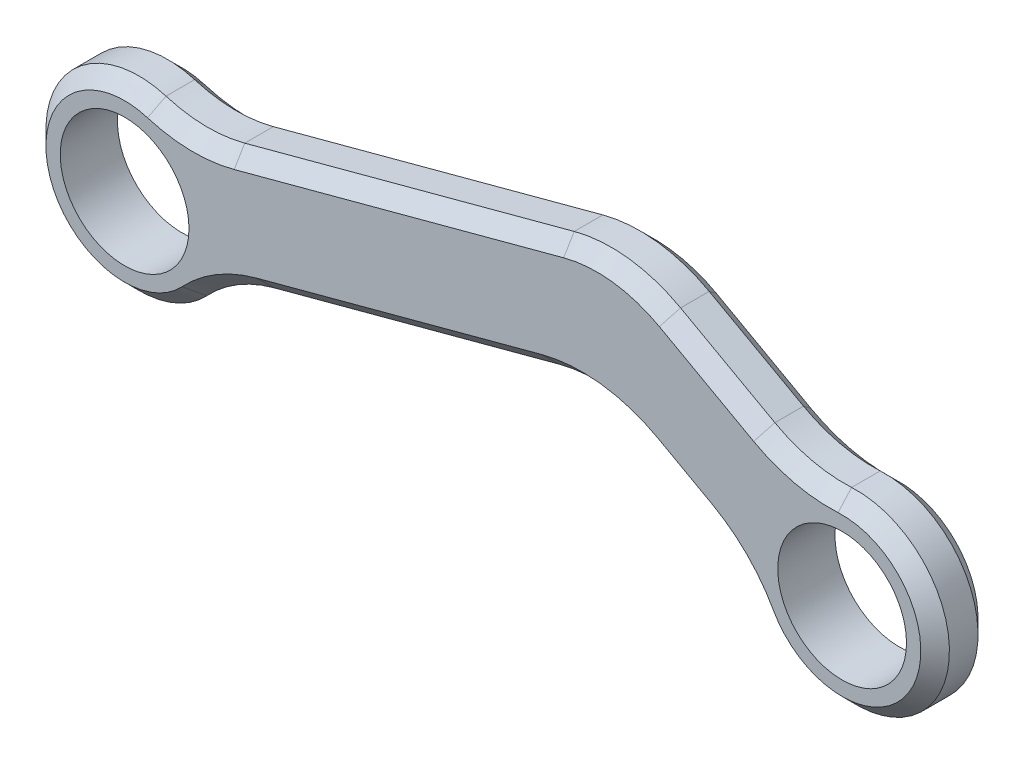
ISO-10303-21;
HEADER;
FILE_DESCRIPTION(('STEP AP214'),'2;1');
FILE_NAME('part.step','',(''),(''),'','','');
FILE_SCHEMA(('AUTOMOTIVE_DESIGN { 1 0 10303 214 1 1 1 1 }'));
ENDSEC;
DATA;
#1=APPLICATION_CONTEXT('core data for automotive mechanical design processes');
#2=APPLICATION_PROTOCOL_DEFINITION('international standard','automotive_design',2000,#1);
#3=PRODUCT_CONTEXT('',#1,'mechanical');
#4=PRODUCT('Part','Part','',(#3));
#5=PRODUCT_RELATED_PRODUCT_CATEGORY('part','',(#4));
#6=PRODUCT_DEFINITION_FORMATION('','',#4);
#7=PRODUCT_DEFINITION_CONTEXT('part definition',#1,'design');
#8=PRODUCT_DEFINITION('design','',#6,#7);
#9=PRODUCT_DEFINITION_SHAPE('','',#8);
#10=(LENGTH_UNIT() NAMED_UNIT(*) SI_UNIT(.MILLI.,.METRE.));
#11=(NAMED_UNIT(*) PLANE_ANGLE_UNIT() SI_UNIT($,.RADIAN.));
#12=(NAMED_UNIT(*) SI_UNIT($,.STERADIAN.) SOLID_ANGLE_UNIT());
#13=UNCERTAINTY_MEASURE_WITH_UNIT(LENGTH_MEASURE(1.E-05),#10,'distance_accuracy_value','');
#14=(GEOMETRIC_REPRESENTATION_CONTEXT(3) GLOBAL_UNCERTAINTY_ASSIGNED_CONTEXT((#13)) GLOBAL_UNIT_ASSIGNED_CONTEXT((#10,
#11,#12)) REPRESENTATION_CONTEXT('',''));
#15=CARTESIAN_POINT('',(0.,0.,0.));
#16=DIRECTION('',(0.,0.,1.));
#17=DIRECTION('',(1.,0.,0.));
#18=AXIS2_PLACEMENT_3D('',#15,#16,#17);
#19=CARTESIAN_POINT('',(50.16,0.,4.));
#20=DIRECTION('',(0.,0.,1.));
#21=DIRECTION('',(1.,0.,0.));
#22=AXIS2_PLACEMENT_3D('',#19,#20,#21);
#23=PLANE('',#22);
#24=DIRECTION('',(0.965925826289068,0.258819045102522,0.));
#25=VECTOR('',#24,1.);
#26=CARTESIAN_POINT('',(29.1223366760669,4.69747805282916,4.));
#27=LINE('',#26,#25);
#28=CARTESIAN_POINT('',(9.21104180316654,-0.637737328622465,4.));
#29=VERTEX_POINT('',#28);
#30=CARTESIAN_POINT('',(29.1223366760669,4.69747805282915,4.));
#31=VERTEX_POINT('',#30);
#32=EDGE_CURVE('E62',#29,#31,#27,.T.);
#33=ORIENTED_EDGE('',*,*,#32,.T.);
#34=CARTESIAN_POINT('',(31.9693461721946,-5.92770603635059,4.));
#35=DIRECTION('',(0.,0.,1.));
#36=DIRECTION('',(1.,0.,0.));
#37=AXIS2_PLACEMENT_3D('',#34,#35,#36);
#38=CIRCLE('',#37,11.);
#39=CARTESIAN_POINT('',(37.2996746676149,3.69453892680173,4.));
#40=VERTEX_POINT('',#39);
#41=EDGE_CURVE('E11',#31,#40,#38,.F.);
#42=ORIENTED_EDGE('',*,*,#41,.T.);
#43=DIRECTION('',(0.874749542104756,-0.484575317765484,0.));
#44=VECTOR('',#43,1.);
#45=CARTESIAN_POINT('',(41.0678520527508,1.60712342566822,4.));
#46=LINE('',#45,#44);
#47=CARTESIAN_POINT('',(41.0678520527508,1.60712342566822,4.));
#48=VERTEX_POINT('',#47);
#49=EDGE_CURVE('E51',#40,#48,#46,.T.);
#50=ORIENTED_EDGE('',*,*,#49,.T.);
#51=CARTESIAN_POINT('',(35.7375235573304,-8.0151215374841,4.));
#52=DIRECTION('',(0.,0.,1.));
#53=DIRECTION('',(1.,0.,0.));
#54=AXIS2_PLACEMENT_3D('',#51,#52,#53);
#55=CIRCLE('',#54,11.);
#56=CARTESIAN_POINT('',(45.3525078524435,-2.67170717916137,4.));
#57=VERTEX_POINT('',#56);
#58=EDGE_CURVE('E348',#48,#57,#55,.F.);
#59=ORIENTED_EDGE('',*,*,#58,.T.);
#60=CARTESIAN_POINT('',(50.16,0.,4.));
#61=DIRECTION('',(0.,0.,1.));
#62=DIRECTION('',(1.,0.,0.));
#63=AXIS2_PLACEMENT_3D('',#60,#61,#62);
#64=CIRCLE('',#63,5.5);
#65=CARTESIAN_POINT('',(49.8752108182547,5.49262188048302,4.));
#66=VERTEX_POINT('',#65);
#67=EDGE_CURVE('E344',#57,#66,#64,.T.);
#68=ORIENTED_EDGE('',*,*,#67,.T.);
#69=CARTESIAN_POINT('',(49.305632454764,16.4778656414491,4.));
#70=DIRECTION('',(0.,0.,1.));
#71=DIRECTION('',(1.,0.,0.));
#72=AXIS2_PLACEMENT_3D('',#69,#70,#71);
#73=CIRCLE('',#72,11.);
#74=CARTESIAN_POINT('',(43.9753039593437,6.85562067829675,4.));
#75=VERTEX_POINT('',#74);
#76=EDGE_CURVE('E340',#66,#75,#73,.F.);
#77=ORIENTED_EDGE('',*,*,#76,.T.);
#78=DIRECTION('',(-0.874749542104756,0.484575317765485,0.));
#79=VECTOR('',#78,1.);
#80=CARTESIAN_POINT('',(37.3808427451827,10.508681336843,4.));
#81=LINE('',#80,#79);
#82=CARTESIAN_POINT('',(37.3808427451827,10.508681336843,4.));
#83=VERTEX_POINT('',#82);
#84=EDGE_CURVE('E336',#75,#83,#81,.T.);
#85=ORIENTED_EDGE('',*,*,#84,.T.);
#86=CARTESIAN_POINT('',(33.0196648852933,2.63593545790018,4.));
#87=DIRECTION('',(0.,0.,1.));
#88=DIRECTION('',(1.,0.,0.));
#89=AXIS2_PLACEMENT_3D('',#86,#87,#88);
#90=CIRCLE('',#89,9.00000000000001);
#91=CARTESIAN_POINT('',(30.6902934793706,11.3292678945018,4.));
#92=VERTEX_POINT('',#91);
#93=EDGE_CURVE('E338',#83,#92,#90,.T.);
#94=ORIENTED_EDGE('',*,*,#93,.T.);
#95=DIRECTION('',(-0.965925826289068,-0.258819045102521,0.));
#96=VECTOR('',#95,1.);
#97=CARTESIAN_POINT('',(7.65812753255141,5.15781762911196,4.));
#98=LINE('',#97,#96);
#99=CARTESIAN_POINT('',(7.65812753255141,5.15781762911196,4.));
#100=VERTEX_POINT('',#99);
#101=EDGE_CURVE('E342',#92,#100,#98,.T.);
#102=ORIENTED_EDGE('',*,*,#101,.T.);
#103=CARTESIAN_POINT('',(4.81111803642367,15.7830017182917,4.));
#104=DIRECTION('',(0.,0.,1.));
#105=DIRECTION('',(1.,0.,0.));
#106=AXIS2_PLACEMENT_3D('',#103,#104,#105);
#107=CIRCLE('',#106,11.);
#108=CARTESIAN_POINT('',(1.60370601214123,5.2610005727639,4.));
#109=VERTEX_POINT('',#108);
#110=EDGE_CURVE('E346',#100,#109,#107,.F.);
#111=ORIENTED_EDGE('',*,*,#110,.T.);
#112=CARTESIAN_POINT('',(0.,0.,4.));
#113=DIRECTION('',(0.,0.,1.));
#114=DIRECTION('',(1.,0.,0.));
#115=AXIS2_PLACEMENT_3D('',#112,#113,#114);
#116=CIRCLE('',#115,5.50000000000001);
#117=CARTESIAN_POINT('',(4.01935043309809,-3.75430713926741,4.));
#118=VERTEX_POINT('',#117);
#119=EDGE_CURVE('E350',#109,#118,#116,.T.);
#120=ORIENTED_EDGE('',*,*,#119,.T.);
#121=CARTESIAN_POINT('',(12.0580512992943,-11.2629214178022,4.));
#122=DIRECTION('',(0.,0.,1.));
#123=DIRECTION('',(1.,0.,0.));
#124=AXIS2_PLACEMENT_3D('',#121,#122,#123);
#125=CIRCLE('',#124,11.);
#126=EDGE_CURVE('E352',#118,#29,#125,.F.);
#127=ORIENTED_EDGE('',*,*,#126,.T.);
#128=EDGE_LOOP('',(#33,#42,#50,#59,#68,#77,#85,#94,#102,#111,#120,#127));
#129=FACE_BOUND('',#128,.T.);
#130=CARTESIAN_POINT('',(0.,0.,4.));
#131=DIRECTION('',(0.,0.,1.));
#132=DIRECTION('',(1.,0.,0.));
#133=AXIS2_PLACEMENT_3D('',#130,#131,#132);
#134=CIRCLE('',#133,4.5);
#135=CARTESIAN_POINT('',(4.5,0.,4.));
#136=VERTEX_POINT('',#135);
#137=EDGE_CURVE('E691',#136,#136,#134,.T.);
#138=ORIENTED_EDGE('',*,*,#137,.F.);
#139=EDGE_LOOP('',(#138));
#140=FACE_BOUND('',#139,.T.);
#141=CARTESIAN_POINT('',(50.16,0.,4.));
#142=DIRECTION('',(0.,0.,1.));
#143=DIRECTION('',(1.,0.,0.));
#144=AXIS2_PLACEMENT_3D('',#141,#142,#143);
#145=CIRCLE('',#144,4.5);
#146=CARTESIAN_POINT('',(54.66,0.,4.));
#147=VERTEX_POINT('',#146);
#148=EDGE_CURVE('E713',#147,#147,#145,.T.);
#149=ORIENTED_EDGE('',*,*,#148,.F.);
#150=EDGE_LOOP('',(#149));
#151=FACE_BOUND('',#150,.T.);
#152=ADVANCED_FACE('F41',(#129,#140,#151),#23,.T.);
#153=CARTESIAN_POINT('',(50.16,0.,0.));
#154=DIRECTION('',(0.,0.,1.));
#155=DIRECTION('',(1.,0.,0.));
#156=AXIS2_PLACEMENT_3D('',#153,#154,#155);
#157=PLANE('',#156);
#158=DIRECTION('',(-0.874749542104756,0.484575317765484,0.));
#159=VECTOR('',#158,1.);
#160=CARTESIAN_POINT('',(48.7062740467035,-2.62424862631426,0.));
#161=LINE('',#160,#159);
#162=CARTESIAN_POINT('',(41.0678520527508,1.60712342566822,0.));
#163=VERTEX_POINT('',#162);
#164=CARTESIAN_POINT('',(37.2996746676149,3.69453892680172,0.));
#165=VERTEX_POINT('',#164);
#166=EDGE_CURVE('E426',#163,#165,#161,.T.);
#167=ORIENTED_EDGE('',*,*,#166,.T.);
#168=CARTESIAN_POINT('',(31.9693461721946,-5.92770603635059,0.));
#169=DIRECTION('',(0.,0.,1.));
#170=DIRECTION('',(1.,0.,0.));
#171=AXIS2_PLACEMENT_3D('',#168,#169,#170);
#172=CIRCLE('',#171,11.);
#173=CARTESIAN_POINT('',(29.1223366760669,4.69747805282915,0.));
#174=VERTEX_POINT('',#173);
#175=EDGE_CURVE('E430',#165,#174,#172,.T.);
#176=ORIENTED_EDGE('',*,*,#175,.T.);
#177=DIRECTION('',(-0.965925826289068,-0.258819045102522,0.));
#178=VECTOR('',#177,1.);
#179=CARTESIAN_POINT('',(47.5763742622213,9.64222252113282,0.));
#180=LINE('',#179,#178);
#181=CARTESIAN_POINT('',(9.21104180316654,-0.637737328622466,0.));
#182=VERTEX_POINT('',#181);
#183=EDGE_CURVE('E428',#174,#182,#180,.T.);
#184=ORIENTED_EDGE('',*,*,#183,.T.);
#185=CARTESIAN_POINT('',(12.0580512992943,-11.2629214178022,0.));
#186=DIRECTION('',(0.,0.,1.));
#187=DIRECTION('',(1.,0.,0.));
#188=AXIS2_PLACEMENT_3D('',#185,#186,#187);
#189=CIRCLE('',#188,11.);
#190=CARTESIAN_POINT('',(4.01935043309809,-3.75430713926741,0.));
#191=VERTEX_POINT('',#190);
#192=EDGE_CURVE('E424',#182,#191,#189,.T.);
#193=ORIENTED_EDGE('',*,*,#192,.T.);
#194=CARTESIAN_POINT('',(0.,0.,0.));
#195=DIRECTION('',(0.,0.,1.));
#196=DIRECTION('',(1.,0.,0.));
#197=AXIS2_PLACEMENT_3D('',#194,#195,#196);
#198=CIRCLE('',#197,5.50000000000001);
#199=CARTESIAN_POINT('',(1.60370601214122,5.2610005727639,0.));
#200=VERTEX_POINT('',#199);
#201=EDGE_CURVE('E420',#191,#200,#198,.F.);
#202=ORIENTED_EDGE('',*,*,#201,.T.);
#203=CARTESIAN_POINT('',(4.81111803642367,15.7830017182917,0.));
#204=DIRECTION('',(0.,0.,1.));
#205=DIRECTION('',(1.,0.,0.));
#206=AXIS2_PLACEMENT_3D('',#203,#204,#205);
#207=CIRCLE('',#206,11.);
#208=CARTESIAN_POINT('',(7.65812753255141,5.15781762911196,0.));
#209=VERTEX_POINT('',#208);
#210=EDGE_CURVE('E209',#200,#209,#207,.T.);
#211=ORIENTED_EDGE('',*,*,#210,.T.);
#212=DIRECTION('',(0.965925826289068,0.258819045102521,0.));
#213=VECTOR('',#212,1.);
#214=CARTESIAN_POINT('',(46.0234599916061,15.4377774788672,0.));
#215=LINE('',#214,#213);
#216=CARTESIAN_POINT('',(30.6902934793706,11.3292678945018,0.));
#217=VERTEX_POINT('',#216);
#218=EDGE_CURVE('E202',#209,#217,#215,.T.);
#219=ORIENTED_EDGE('',*,*,#218,.T.);
#220=CARTESIAN_POINT('',(33.0196648852933,2.63593545790018,0.));
#221=DIRECTION('',(0.,0.,1.));
#222=DIRECTION('',(1.,0.,0.));
#223=AXIS2_PLACEMENT_3D('',#220,#221,#222);
#224=CIRCLE('',#223,9.00000000000001);
#225=CARTESIAN_POINT('',(37.3808427451827,10.508681336843,0.));
#226=VERTEX_POINT('',#225);
#227=EDGE_CURVE('E206',#217,#226,#224,.F.);
#228=ORIENTED_EDGE('',*,*,#227,.T.);
#229=DIRECTION('',(0.874749542104756,-0.484575317765485,0.));
#230=VECTOR('',#229,1.);
#231=CARTESIAN_POINT('',(51.6137259532965,2.62424862631427,0.));
#232=LINE('',#231,#230);
#233=CARTESIAN_POINT('',(43.9753039593437,6.85562067829675,0.));
#234=VERTEX_POINT('',#233);
#235=EDGE_CURVE('E215',#226,#234,#232,.T.);
#236=ORIENTED_EDGE('',*,*,#235,.T.);
#237=CARTESIAN_POINT('',(49.305632454764,16.4778656414491,0.));
#238=DIRECTION('',(0.,0.,1.));
#239=DIRECTION('',(1.,0.,0.));
#240=AXIS2_PLACEMENT_3D('',#237,#238,#239);
#241=CIRCLE('',#240,11.);
#242=CARTESIAN_POINT('',(49.8752108182547,5.49262188048302,0.));
#243=VERTEX_POINT('',#242);
#244=EDGE_CURVE('E214',#234,#243,#241,.T.);
#245=ORIENTED_EDGE('',*,*,#244,.T.);
#246=CARTESIAN_POINT('',(50.16,0.,0.));
#247=DIRECTION('',(0.,0.,1.));
#248=DIRECTION('',(1.,0.,0.));
#249=AXIS2_PLACEMENT_3D('',#246,#247,#248);
#250=CIRCLE('',#249,5.5);
#251=CARTESIAN_POINT('',(45.3525078524435,-2.67170717916137,0.));
#252=VERTEX_POINT('',#251);
#253=EDGE_CURVE('E418',#243,#252,#250,.F.);
#254=ORIENTED_EDGE('',*,*,#253,.T.);
#255=CARTESIAN_POINT('',(35.7375235573304,-8.0151215374841,0.));
#256=DIRECTION('',(0.,0.,1.));
#257=DIRECTION('',(1.,0.,0.));
#258=AXIS2_PLACEMENT_3D('',#255,#256,#257);
#259=CIRCLE('',#258,11.);
#260=EDGE_CURVE('E422',#252,#163,#259,.T.);
#261=ORIENTED_EDGE('',*,*,#260,.T.);
#262=EDGE_LOOP('',(#167,#176,#184,#193,#202,#211,#219,#228,#236,#245,#254,#261));
#263=FACE_BOUND('',#262,.T.);
#264=CARTESIAN_POINT('',(0.,0.,0.));
#265=DIRECTION('',(0.,0.,1.));
#266=DIRECTION('',(1.,0.,0.));
#267=AXIS2_PLACEMENT_3D('',#264,#265,#266);
#268=CIRCLE('',#267,4.5);
#269=CARTESIAN_POINT('',(4.5,0.,0.));
#270=VERTEX_POINT('',#269);
#271=EDGE_CURVE('E710',#270,#270,#268,.T.);
#272=ORIENTED_EDGE('',*,*,#271,.T.);
#273=EDGE_LOOP('',(#272));
#274=FACE_BOUND('',#273,.T.);
#275=CARTESIAN_POINT('',(50.16,0.,0.));
#276=DIRECTION('',(0.,0.,1.));
#277=DIRECTION('',(1.,0.,0.));
#278=AXIS2_PLACEMENT_3D('',#275,#276,#277);
#279=CIRCLE('',#278,4.5);
#280=CARTESIAN_POINT('',(54.66,0.,0.));
#281=VERTEX_POINT('',#280);
#282=EDGE_CURVE('E232',#281,#281,#279,.T.);
#283=ORIENTED_EDGE('',*,*,#282,.T.);
#284=EDGE_LOOP('',(#283));
#285=FACE_BOUND('',#284,.T.);
#286=ADVANCED_FACE('F204',(#263,#274,#285),#157,.F.);
#287=CARTESIAN_POINT('',(33.282244563568,4.77684583146287,4.));
#288=DIRECTION('',(0.484575317765484,0.874749542104756,0.));
#289=DIRECTION('',(-0.874749542104756,0.484575317765484,0.));
#290=AXIS2_PLACEMENT_3D('',#287,#288,#289);
#291=PLANE('',#290);
#292=DIRECTION('',(0.,0.,-1.));
#293=VECTOR('',#292,1.);
#294=CARTESIAN_POINT('',(36.8150993498494,2.81978938469697,0.));
#295=LINE('',#294,#293);
#296=CARTESIAN_POINT('',(36.8150993498494,2.81978938469697,3.00000000000001));
#297=VERTEX_POINT('',#296);
#298=CARTESIAN_POINT('',(36.8150993498494,2.81978938469697,0.999999999999996));
#299=VERTEX_POINT('',#298);
#300=EDGE_CURVE('E683',#297,#299,#295,.T.);
#301=ORIENTED_EDGE('',*,*,#300,.T.);
#302=DIRECTION('',(0.874749542104756,-0.484575317765484,0.));
#303=VECTOR('',#302,1.);
#304=CARTESIAN_POINT('',(33.282244563568,4.77684583146287,0.999999999999997));
#305=LINE('',#304,#303);
#306=CARTESIAN_POINT('',(40.5832767349853,0.732373883563467,0.999999999999996));
#307=VERTEX_POINT('',#306);
#308=EDGE_CURVE('E443',#299,#307,#305,.T.);
#309=ORIENTED_EDGE('',*,*,#308,.T.);
#310=DIRECTION('',(0.,0.,1.));
#311=VECTOR('',#310,1.);
#312=CARTESIAN_POINT('',(40.5832767349853,0.732373883563467,4.));
#313=LINE('',#312,#311);
#314=CARTESIAN_POINT('',(40.5832767349853,0.732373883563467,3.00000000000001));
#315=VERTEX_POINT('',#314);
#316=EDGE_CURVE('E685',#307,#315,#313,.T.);
#317=ORIENTED_EDGE('',*,*,#316,.T.);
#318=DIRECTION('',(-0.874749542104756,0.484575317765484,0.));
#319=VECTOR('',#318,1.);
#320=CARTESIAN_POINT('',(36.8150993498494,2.81978938469697,2.99999999999999));
#321=LINE('',#320,#319);
#322=EDGE_CURVE('E364',#315,#297,#321,.T.);
#323=ORIENTED_EDGE('',*,*,#322,.T.);
#324=EDGE_LOOP('',(#301,#309,#317,#323));
#325=FACE_BOUND('',#324,.T.);
#326=ADVANCED_FACE('F493',(#325),#291,.F.);
#327=CARTESIAN_POINT('',(50.16,0.,4.));
#328=DIRECTION('',(0.,0.,-1.));
#329=DIRECTION('',(-1.,0.,0.));
#330=AXIS2_PLACEMENT_3D('',#327,#328,#329);
#331=CYLINDRICAL_SURFACE('',#330,6.5);
#332=DIRECTION('',(0.,0.,-1.));
#333=VECTOR('',#332,1.);
#334=CARTESIAN_POINT('',(44.4784183710696,-3.15747212082707,4.));
#335=LINE('',#334,#333);
#336=CARTESIAN_POINT('',(44.4784183710696,-3.15747212082707,3.00000000000001));
#337=VERTEX_POINT('',#336);
#338=CARTESIAN_POINT('',(44.4784183710696,-3.15747212082707,0.999999999999996));
#339=VERTEX_POINT('',#338);
#340=EDGE_CURVE('E410',#337,#339,#335,.T.);
#341=ORIENTED_EDGE('',*,*,#340,.T.);
#342=CARTESIAN_POINT('',(50.16,0.,0.999999999999996));
#343=DIRECTION('',(0.,0.,1.));
#344=DIRECTION('',(1.,0.,0.));
#345=AXIS2_PLACEMENT_3D('',#342,#343,#344);
#346=CIRCLE('',#345,6.5);
#347=CARTESIAN_POINT('',(49.8234309670282,6.4912804042072,0.999999999999996));
#348=VERTEX_POINT('',#347);
#349=EDGE_CURVE('E320',#339,#348,#346,.T.);
#350=ORIENTED_EDGE('',*,*,#349,.T.);
#351=DIRECTION('',(0.,0.,-1.));
#352=VECTOR('',#351,1.);
#353=CARTESIAN_POINT('',(49.8234309670282,6.4912804042072,4.));
#354=LINE('',#353,#352);
#355=CARTESIAN_POINT('',(49.8234309670282,6.4912804042072,3.00000000000001));
#356=VERTEX_POINT('',#355);
#357=EDGE_CURVE('E226',#348,#356,#354,.F.);
#358=ORIENTED_EDGE('',*,*,#357,.T.);
#359=CARTESIAN_POINT('',(50.16,0.,3.00000000000001));
#360=DIRECTION('',(0.,0.,1.));
#361=DIRECTION('',(1.,0.,0.));
#362=AXIS2_PLACEMENT_3D('',#359,#360,#361);
#363=CIRCLE('',#362,6.5);
#364=EDGE_CURVE('E373',#356,#337,#363,.F.);
#365=ORIENTED_EDGE('',*,*,#364,.T.);
#366=EDGE_LOOP('',(#341,#350,#358,#365));
#367=FACE_BOUND('',#366,.T.);
#368=ADVANCED_FACE('F459',(#367),#331,.T.);
#369=CARTESIAN_POINT('',(34.3325632766668,13.3404873257136,4.));
#370=DIRECTION('',(-0.484575317765485,-0.874749542104756,0.));
#371=DIRECTION('',(0.874749542104756,-0.484575317765485,0.));
#372=AXIS2_PLACEMENT_3D('',#369,#370,#371);
#373=PLANE('',#372);
#374=DIRECTION('',(0.,0.,1.));
#375=VECTOR('',#374,1.);
#376=CARTESIAN_POINT('',(44.4598792771092,7.7303702204015,0.));
#377=LINE('',#376,#375);
#378=CARTESIAN_POINT('',(44.4598792771092,7.7303702204015,3.00000000000001));
#379=VERTEX_POINT('',#378);
#380=CARTESIAN_POINT('',(44.4598792771092,7.7303702204015,0.999999999999996));
#381=VERTEX_POINT('',#380);
#382=EDGE_CURVE('E401',#379,#381,#377,.F.);
#383=ORIENTED_EDGE('',*,*,#382,.T.);
#384=DIRECTION('',(-0.874749542104756,0.484575317765485,0.));
#385=VECTOR('',#384,1.);
#386=CARTESIAN_POINT('',(34.3325632766668,13.3404873257136,0.999999999999996));
#387=LINE('',#386,#385);
#388=CARTESIAN_POINT('',(37.8654180629482,11.3834308789477,0.999999999999996));
#389=VERTEX_POINT('',#388);
#390=EDGE_CURVE('E330',#381,#389,#387,.T.);
#391=ORIENTED_EDGE('',*,*,#390,.T.);
#392=DIRECTION('',(0.,0.,-1.));
#393=VECTOR('',#392,1.);
#394=CARTESIAN_POINT('',(37.8654180629482,11.3834308789477,4.));
#395=LINE('',#394,#393);
#396=CARTESIAN_POINT('',(37.8654180629482,11.3834308789477,3.00000000000001));
#397=VERTEX_POINT('',#396);
#398=EDGE_CURVE('E392',#389,#397,#395,.F.);
#399=ORIENTED_EDGE('',*,*,#398,.T.);
#400=DIRECTION('',(0.874749542104756,-0.484575317765485,0.));
#401=VECTOR('',#400,1.);
#402=CARTESIAN_POINT('',(44.4598792771092,7.7303702204015,3.00000000000001));
#403=LINE('',#402,#401);
#404=EDGE_CURVE('E328',#397,#379,#403,.T.);
#405=ORIENTED_EDGE('',*,*,#404,.T.);
#406=EDGE_LOOP('',(#383,#391,#399,#405));
#407=FACE_BOUND('',#406,.T.);
#408=ADVANCED_FACE('F397',(#407),#373,.F.);
#409=CARTESIAN_POINT('',(3.91362101236637,5.18975631138538,4.));
#410=DIRECTION('',(0.258819045102521,-0.965925826289068,0.));
#411=DIRECTION('',(0.965925826289068,0.258819045102521,0.));
#412=AXIS2_PLACEMENT_3D('',#409,#410,#411);
#413=PLANE('',#412);
#414=DIRECTION('',(0.,0.,-1.));
#415=VECTOR('',#414,1.);
#416=CARTESIAN_POINT('',(30.4314744342681,12.2951937207909,4.));
#417=LINE('',#416,#415);
#418=CARTESIAN_POINT('',(30.4314744342681,12.2951937207909,3.00000000000001));
#419=VERTEX_POINT('',#418);
#420=CARTESIAN_POINT('',(30.4314744342681,12.2951937207909,0.999999999999996));
#421=VERTEX_POINT('',#420);
#422=EDGE_CURVE('E394',#419,#421,#417,.T.);
#423=ORIENTED_EDGE('',*,*,#422,.T.);
#424=DIRECTION('',(-0.965925826289068,-0.258819045102521,0.));
#425=VECTOR('',#424,1.);
#426=CARTESIAN_POINT('',(3.91362101236637,5.18975631138538,0.999999999999996));
#427=LINE('',#426,#425);
#428=CARTESIAN_POINT('',(7.39930848744889,6.12374345540102,0.999999999999996));
#429=VERTEX_POINT('',#428);
#430=EDGE_CURVE('E229',#421,#429,#427,.T.);
#431=ORIENTED_EDGE('',*,*,#430,.T.);
#432=DIRECTION('',(0.,0.,1.));
#433=VECTOR('',#432,1.);
#434=CARTESIAN_POINT('',(7.39930848744889,6.12374345540102,4.));
#435=LINE('',#434,#433);
#436=CARTESIAN_POINT('',(7.39930848744889,6.12374345540102,3.));
#437=VERTEX_POINT('',#436);
#438=EDGE_CURVE('E696',#429,#437,#435,.T.);
#439=ORIENTED_EDGE('',*,*,#438,.T.);
#440=DIRECTION('',(0.965925826289068,0.258819045102521,0.));
#441=VECTOR('',#440,1.);
#442=CARTESIAN_POINT('',(30.4314744342681,12.2951937207909,3.));
#443=LINE('',#442,#441);
#444=EDGE_CURVE('E325',#437,#419,#443,.T.);
#445=ORIENTED_EDGE('',*,*,#444,.T.);
#446=EDGE_LOOP('',(#423,#431,#439,#445));
#447=FACE_BOUND('',#446,.T.);
#448=ADVANCED_FACE('F506',(#447),#413,.F.);
#449=CARTESIAN_POINT('',(0.,0.,4.));
#450=DIRECTION('',(0.,0.,-1.));
#451=DIRECTION('',(-1.,0.,0.));
#452=AXIS2_PLACEMENT_3D('',#449,#450,#451);
#453=CYLINDRICAL_SURFACE('',#452,6.5);
#454=DIRECTION('',(0.,0.,-1.));
#455=VECTOR('',#454,1.);
#456=CARTESIAN_POINT('',(1.89528892343963,6.21754613144825,4.));
#457=LINE('',#456,#455);
#458=CARTESIAN_POINT('',(1.89528892343963,6.21754613144825,3.00000000000001));
#459=VERTEX_POINT('',#458);
#460=CARTESIAN_POINT('',(1.89528892343963,6.21754613144825,0.999999999999996));
#461=VERTEX_POINT('',#460);
#462=EDGE_CURVE('E400',#459,#461,#457,.T.);
#463=ORIENTED_EDGE('',*,*,#462,.T.);
#464=CARTESIAN_POINT('',(0.,0.,0.999999999999996));
#465=DIRECTION('',(0.,0.,1.));
#466=DIRECTION('',(1.,0.,0.));
#467=AXIS2_PLACEMENT_3D('',#464,#465,#466);
#468=CIRCLE('',#467,6.5);
#469=CARTESIAN_POINT('',(4.75014142093411,-4.43690843731602,0.999999999999996));
#470=VERTEX_POINT('',#469);
#471=EDGE_CURVE('E454',#461,#470,#468,.T.);
#472=ORIENTED_EDGE('',*,*,#471,.T.);
#473=DIRECTION('',(0.,0.,-1.));
#474=VECTOR('',#473,1.);
#475=CARTESIAN_POINT('',(4.75014142093411,-4.43690843731602,4.));
#476=LINE('',#475,#474);
#477=CARTESIAN_POINT('',(4.75014142093411,-4.43690843731602,3.00000000000001));
#478=VERTEX_POINT('',#477);
#479=EDGE_CURVE('E403',#470,#478,#476,.F.);
#480=ORIENTED_EDGE('',*,*,#479,.T.);
#481=CARTESIAN_POINT('',(0.,0.,3.00000000000001));
#482=DIRECTION('',(0.,0.,1.));
#483=DIRECTION('',(1.,0.,0.));
#484=AXIS2_PLACEMENT_3D('',#481,#482,#483);
#485=CIRCLE('',#484,6.5);
#486=EDGE_CURVE('E452',#478,#459,#485,.F.);
#487=ORIENTED_EDGE('',*,*,#486,.T.);
#488=EDGE_LOOP('',(#463,#472,#480,#487));
#489=FACE_BOUND('',#488,.T.);
#490=ADVANCED_FACE('F502',(#489),#453,.T.);
#491=CARTESIAN_POINT('',(5.98417337318655,-2.53765029892717,4.));
#492=DIRECTION('',(-0.258819045102522,0.965925826289068,0.));
#493=DIRECTION('',(-0.965925826289068,-0.258819045102522,0.));
#494=AXIS2_PLACEMENT_3D('',#491,#492,#493);
#495=PLANE('',#494);
#496=DIRECTION('',(0.,0.,1.));
#497=VECTOR('',#496,1.);
#498=CARTESIAN_POINT('',(9.46986084826906,-1.60366315491153,0.));
#499=LINE('',#498,#497);
#500=CARTESIAN_POINT('',(9.46986084826906,-1.60366315491153,3.00000000000001));
#501=VERTEX_POINT('',#500);
#502=CARTESIAN_POINT('',(9.46986084826906,-1.60366315491153,0.999999999999996));
#503=VERTEX_POINT('',#502);
#504=EDGE_CURVE('E686',#501,#503,#499,.F.);
#505=ORIENTED_EDGE('',*,*,#504,.T.);
#506=DIRECTION('',(0.965925826289068,0.258819045102522,0.));
#507=VECTOR('',#506,1.);
#508=CARTESIAN_POINT('',(5.98417337318655,-2.53765029892717,0.999999999999996));
#509=LINE('',#508,#507);
#510=CARTESIAN_POINT('',(29.3811557211694,3.73155222654009,0.999999999999996));
#511=VERTEX_POINT('',#510);
#512=EDGE_CURVE('E440',#503,#511,#509,.T.);
#513=ORIENTED_EDGE('',*,*,#512,.T.);
#514=DIRECTION('',(0.,0.,-1.));
#515=VECTOR('',#514,1.);
#516=CARTESIAN_POINT('',(29.3811557211694,3.73155222654009,4.));
#517=LINE('',#516,#515);
#518=CARTESIAN_POINT('',(29.3811557211694,3.73155222654009,3.00000000000001));
#519=VERTEX_POINT('',#518);
#520=EDGE_CURVE('E689',#511,#519,#517,.F.);
#521=ORIENTED_EDGE('',*,*,#520,.T.);
#522=DIRECTION('',(-0.965925826289068,-0.258819045102522,0.));
#523=VECTOR('',#522,1.);
#524=CARTESIAN_POINT('',(9.46986084826906,-1.60366315491153,3.00000000000001));
#525=LINE('',#524,#523);
#526=EDGE_CURVE('E438',#519,#501,#525,.T.);
#527=ORIENTED_EDGE('',*,*,#526,.T.);
#528=EDGE_LOOP('',(#505,#513,#521,#527));
#529=FACE_BOUND('',#528,.T.);
#530=ADVANCED_FACE('F499',(#529),#495,.F.);
#531=CARTESIAN_POINT('',(0.,0.,4.));
#532=DIRECTION('',(0.,0.,-1.));
#533=DIRECTION('',(-1.,0.,0.));
#534=AXIS2_PLACEMENT_3D('',#531,#532,#533);
#535=CYLINDRICAL_SURFACE('',#534,4.5);
#536=ORIENTED_EDGE('',*,*,#137,.T.);
#537=EDGE_LOOP('',(#536));
#538=FACE_BOUND('',#537,.T.);
#539=ORIENTED_EDGE('',*,*,#271,.F.);
#540=EDGE_LOOP('',(#539));
#541=FACE_BOUND('',#540,.T.);
#542=ADVANCED_FACE('F496',(#538,#541),#535,.F.);
#543=CARTESIAN_POINT('',(50.16,0.,4.));
#544=DIRECTION('',(0.,0.,-1.));
#545=DIRECTION('',(-1.,0.,0.));
#546=AXIS2_PLACEMENT_3D('',#543,#544,#545);
#547=CYLINDRICAL_SURFACE('',#546,4.5);
#548=ORIENTED_EDGE('',*,*,#148,.T.);
#549=EDGE_LOOP('',(#548));
#550=FACE_BOUND('',#549,.T.);
#551=ORIENTED_EDGE('',*,*,#282,.F.);
#552=EDGE_LOOP('',(#551));
#553=FACE_BOUND('',#552,.T.);
#554=ADVANCED_FACE('F521',(#550,#553),#547,.F.);
#555=CARTESIAN_POINT('',(31.9693461721946,-5.92770603635059,4.));
#556=DIRECTION('',(0.,0.,1.));
#557=DIRECTION('',(1.,0.,0.));
#558=AXIS2_PLACEMENT_3D('',#555,#556,#557);
#559=CYLINDRICAL_SURFACE('',#558,10.);
#560=ORIENTED_EDGE('',*,*,#520,.F.);
#561=CARTESIAN_POINT('',(31.9693461721946,-5.92770603635059,1.00000000000001));
#562=DIRECTION('',(0.,0.,1.));
#563=DIRECTION('',(1.,0.,0.));
#564=AXIS2_PLACEMENT_3D('',#561,#562,#563);
#565=CIRCLE('',#564,10.);
#566=EDGE_CURVE('E435',#511,#299,#565,.F.);
#567=ORIENTED_EDGE('',*,*,#566,.T.);
#568=ORIENTED_EDGE('',*,*,#300,.F.);
#569=CARTESIAN_POINT('',(31.9693461721946,-5.92770603635059,3.00000000000001));
#570=DIRECTION('',(0.,0.,1.));
#571=DIRECTION('',(1.,0.,0.));
#572=AXIS2_PLACEMENT_3D('',#569,#570,#571);
#573=CIRCLE('',#572,10.);
#574=EDGE_CURVE('E433',#297,#519,#573,.T.);
#575=ORIENTED_EDGE('',*,*,#574,.T.);
#576=EDGE_LOOP('',(#560,#567,#568,#575));
#577=FACE_BOUND('',#576,.T.);
#578=ADVANCED_FACE('F518',(#577),#559,.F.);
#579=CARTESIAN_POINT('',(33.0196648852933,2.63593545790018,4.));
#580=DIRECTION('',(0.,0.,-1.));
#581=DIRECTION('',(-1.,0.,0.));
#582=AXIS2_PLACEMENT_3D('',#579,#580,#581);
#583=CYLINDRICAL_SURFACE('',#582,10.);
#584=ORIENTED_EDGE('',*,*,#398,.F.);
#585=CARTESIAN_POINT('',(33.0196648852933,2.63593545790018,0.999999999999996));
#586=DIRECTION('',(0.,0.,1.));
#587=DIRECTION('',(1.,0.,0.));
#588=AXIS2_PLACEMENT_3D('',#585,#586,#587);
#589=CIRCLE('',#588,10.);
#590=EDGE_CURVE('E334',#389,#421,#589,.T.);
#591=ORIENTED_EDGE('',*,*,#590,.T.);
#592=ORIENTED_EDGE('',*,*,#422,.F.);
#593=CARTESIAN_POINT('',(33.0196648852933,2.63593545790018,3.00000000000001));
#594=DIRECTION('',(0.,0.,1.));
#595=DIRECTION('',(1.,0.,0.));
#596=AXIS2_PLACEMENT_3D('',#593,#594,#595);
#597=CIRCLE('',#596,10.);
#598=EDGE_CURVE('E332',#419,#397,#597,.F.);
#599=ORIENTED_EDGE('',*,*,#598,.T.);
#600=EDGE_LOOP('',(#584,#591,#592,#599));
#601=FACE_BOUND('',#600,.T.);
#602=ADVANCED_FACE('F391',(#601),#583,.T.);
#603=CARTESIAN_POINT('',(12.0580512992943,-11.2629214178022,4.));
#604=DIRECTION('',(0.,0.,-1.));
#605=DIRECTION('',(-1.,0.,0.));
#606=AXIS2_PLACEMENT_3D('',#603,#604,#605);
#607=CYLINDRICAL_SURFACE('',#606,10.);
#608=ORIENTED_EDGE('',*,*,#479,.F.);
#609=CARTESIAN_POINT('',(12.0580512992943,-11.2629214178022,0.999999999999996));
#610=DIRECTION('',(0.,0.,1.));
#611=DIRECTION('',(1.,0.,0.));
#612=AXIS2_PLACEMENT_3D('',#609,#610,#611);
#613=CIRCLE('',#612,10.);
#614=EDGE_CURVE('E447',#470,#503,#613,.F.);
#615=ORIENTED_EDGE('',*,*,#614,.T.);
#616=ORIENTED_EDGE('',*,*,#504,.F.);
#617=CARTESIAN_POINT('',(12.0580512992943,-11.2629214178022,3.00000000000001));
#618=DIRECTION('',(0.,0.,1.));
#619=DIRECTION('',(1.,0.,0.));
#620=AXIS2_PLACEMENT_3D('',#617,#618,#619);
#621=CIRCLE('',#620,10.);
#622=EDGE_CURVE('E445',#501,#478,#621,.T.);
#623=ORIENTED_EDGE('',*,*,#622,.T.);
#624=EDGE_LOOP('',(#608,#615,#616,#623));
#625=FACE_BOUND('',#624,.T.);
#626=ADVANCED_FACE('F525',(#625),#607,.F.);
#627=CARTESIAN_POINT('',(49.305632454764,16.4778656414491,4.));
#628=DIRECTION('',(0.,0.,-1.));
#629=DIRECTION('',(-1.,0.,0.));
#630=AXIS2_PLACEMENT_3D('',#627,#628,#629);
#631=CYLINDRICAL_SURFACE('',#630,10.);
#632=ORIENTED_EDGE('',*,*,#357,.F.);
#633=CARTESIAN_POINT('',(49.305632454764,16.4778656414491,0.999999999999996));
#634=DIRECTION('',(0.,0.,1.));
#635=DIRECTION('',(1.,0.,0.));
#636=AXIS2_PLACEMENT_3D('',#633,#634,#635);
#637=CIRCLE('',#636,10.);
#638=EDGE_CURVE('E318',#348,#381,#637,.F.);
#639=ORIENTED_EDGE('',*,*,#638,.T.);
#640=ORIENTED_EDGE('',*,*,#382,.F.);
#641=CARTESIAN_POINT('',(49.305632454764,16.4778656414491,3.00000000000001));
#642=DIRECTION('',(0.,0.,1.));
#643=DIRECTION('',(1.,0.,0.));
#644=AXIS2_PLACEMENT_3D('',#641,#642,#643);
#645=CIRCLE('',#644,10.);
#646=EDGE_CURVE('E315',#379,#356,#645,.T.);
#647=ORIENTED_EDGE('',*,*,#646,.T.);
#648=EDGE_LOOP('',(#632,#639,#640,#647));
#649=FACE_BOUND('',#648,.T.);
#650=ADVANCED_FACE('F465',(#649),#631,.F.);
#651=CARTESIAN_POINT('',(35.7375235573304,-8.0151215374841,4.));
#652=DIRECTION('',(0.,0.,-1.));
#653=DIRECTION('',(-1.,0.,0.));
#654=AXIS2_PLACEMENT_3D('',#651,#652,#653);
#655=CYLINDRICAL_SURFACE('',#654,10.);
#656=ORIENTED_EDGE('',*,*,#316,.F.);
#657=CARTESIAN_POINT('',(35.7375235573304,-8.0151215374841,0.999999999999996));
#658=DIRECTION('',(0.,0.,1.));
#659=DIRECTION('',(1.,0.,0.));
#660=AXIS2_PLACEMENT_3D('',#657,#658,#659);
#661=CIRCLE('',#660,10.);
#662=EDGE_CURVE('E450',#307,#339,#661,.F.);
#663=ORIENTED_EDGE('',*,*,#662,.T.);
#664=ORIENTED_EDGE('',*,*,#340,.F.);
#665=CARTESIAN_POINT('',(35.7375235573304,-8.0151215374841,3.00000000000001));
#666=DIRECTION('',(0.,0.,1.));
#667=DIRECTION('',(1.,0.,0.));
#668=AXIS2_PLACEMENT_3D('',#665,#666,#667);
#669=CIRCLE('',#668,10.);
#670=EDGE_CURVE('E369',#337,#315,#669,.T.);
#671=ORIENTED_EDGE('',*,*,#670,.T.);
#672=EDGE_LOOP('',(#656,#663,#664,#671));
#673=FACE_BOUND('',#672,.T.);
#674=ADVANCED_FACE('F531',(#673),#655,.F.);
#675=CARTESIAN_POINT('',(4.81111803642367,15.7830017182917,4.));
#676=DIRECTION('',(0.,0.,-1.));
#677=DIRECTION('',(-1.,0.,0.));
#678=AXIS2_PLACEMENT_3D('',#675,#676,#677);
#679=CYLINDRICAL_SURFACE('',#678,10.);
#680=ORIENTED_EDGE('',*,*,#438,.F.);
#681=CARTESIAN_POINT('',(4.81111803642367,15.7830017182917,0.999999999999996));
#682=DIRECTION('',(0.,0.,1.));
#683=DIRECTION('',(1.,0.,0.));
#684=AXIS2_PLACEMENT_3D('',#681,#682,#683);
#685=CIRCLE('',#684,10.);
#686=EDGE_CURVE('E309',#429,#461,#685,.F.);
#687=ORIENTED_EDGE('',*,*,#686,.T.);
#688=ORIENTED_EDGE('',*,*,#462,.F.);
#689=CARTESIAN_POINT('',(4.81111803642367,15.7830017182917,3.00000000000001));
#690=DIRECTION('',(0.,0.,1.));
#691=DIRECTION('',(1.,0.,0.));
#692=AXIS2_PLACEMENT_3D('',#689,#690,#691);
#693=CIRCLE('',#692,10.);
#694=EDGE_CURVE('E316',#459,#437,#693,.T.);
#695=ORIENTED_EDGE('',*,*,#694,.T.);
#696=EDGE_LOOP('',(#680,#687,#688,#695));
#697=FACE_BOUND('',#696,.T.);
#698=ADVANCED_FACE('F484',(#697),#679,.F.);
#699=CARTESIAN_POINT('',(33.0196648852933,2.63593545790018,0.));
#700=DIRECTION('',(0.,0.,1.));
#701=DIRECTION('',(1.,0.,0.));
#702=AXIS2_PLACEMENT_3D('',#699,#700,#701);
#703=CONICAL_SURFACE('',#702,9.00000000000001,0.785398163397447);
#704=DIRECTION('',(0.183012701892219,-0.683012701892219,-0.707106781186548));
#705=VECTOR('',#704,1.);
#706=CARTESIAN_POINT('',(30.4314744342681,12.2951937207909,0.999999999999996));
#707=LINE('',#706,#705);
#708=EDGE_CURVE('E221',#421,#217,#707,.T.);
#709=ORIENTED_EDGE('',*,*,#708,.F.);
#710=ORIENTED_EDGE('',*,*,#590,.F.);
#711=DIRECTION('',(0.3426464931876,0.618541333062099,0.707106781186548));
#712=VECTOR('',#711,1.);
#713=CARTESIAN_POINT('',(37.3808427451827,10.508681336843,0.));
#714=LINE('',#713,#712);
#715=EDGE_CURVE('E224',#226,#389,#714,.T.);
#716=ORIENTED_EDGE('',*,*,#715,.F.);
#717=ORIENTED_EDGE('',*,*,#227,.F.);
#718=EDGE_LOOP('',(#709,#710,#716,#717));
#719=FACE_BOUND('',#718,.T.);
#720=ADVANCED_FACE('F219',(#719),#703,.T.);
#721=CARTESIAN_POINT('',(34.3325632766668,13.3404873257136,0.999999999999996));
#722=DIRECTION('',(-0.342646493187601,-0.618541333062101,0.707106781186546));
#723=DIRECTION('',(-0.874749542104756,0.484575317765485,0.));
#724=AXIS2_PLACEMENT_3D('',#721,#722,#723);
#725=PLANE('',#724);
#726=ORIENTED_EDGE('',*,*,#715,.T.);
#727=ORIENTED_EDGE('',*,*,#390,.F.);
#728=DIRECTION('',(0.3426464931876,0.618541333062099,0.707106781186549));
#729=VECTOR('',#728,1.);
#730=CARTESIAN_POINT('',(43.9753039593437,6.85562067829675,0.));
#731=LINE('',#730,#729);
#732=EDGE_CURVE('E230',#234,#381,#731,.T.);
#733=ORIENTED_EDGE('',*,*,#732,.F.);
#734=ORIENTED_EDGE('',*,*,#235,.F.);
#735=EDGE_LOOP('',(#726,#727,#733,#734));
#736=FACE_BOUND('',#735,.T.);
#737=ADVANCED_FACE('F476',(#736),#725,.F.);
#738=CARTESIAN_POINT('',(3.91362101236637,5.18975631138538,0.999999999999996));
#739=DIRECTION('',(0.18301270189222,-0.68301270189222,0.707106781186546));
#740=DIRECTION('',(-0.965925826289068,-0.258819045102521,0.));
#741=AXIS2_PLACEMENT_3D('',#738,#739,#740);
#742=PLANE('',#741);
#743=ORIENTED_EDGE('',*,*,#708,.T.);
#744=ORIENTED_EDGE('',*,*,#218,.F.);
#745=DIRECTION('',(0.183012701892219,-0.683012701892218,-0.707106781186549));
#746=VECTOR('',#745,1.);
#747=CARTESIAN_POINT('',(7.39930848744889,6.12374345540102,0.999999999999996));
#748=LINE('',#747,#746);
#749=EDGE_CURVE('E235',#429,#209,#748,.T.);
#750=ORIENTED_EDGE('',*,*,#749,.F.);
#751=ORIENTED_EDGE('',*,*,#430,.F.);
#752=EDGE_LOOP('',(#743,#744,#750,#751));
#753=FACE_BOUND('',#752,.T.);
#754=ADVANCED_FACE('F228',(#753),#742,.F.);
#755=CARTESIAN_POINT('',(49.305632454764,16.4778656414491,0.));
#756=DIRECTION('',(0.,0.,-1.));
#757=DIRECTION('',(-1.,0.,0.));
#758=AXIS2_PLACEMENT_3D('',#755,#756,#757);
#759=CONICAL_SURFACE('',#758,11.,0.785398163397448);
#760=ORIENTED_EDGE('',*,*,#732,.T.);
#761=ORIENTED_EDGE('',*,*,#638,.F.);
#762=DIRECTION('',(-0.0366138839310355,0.706158214215118,0.707106781186548));
#763=VECTOR('',#762,1.);
#764=CARTESIAN_POINT('',(49.8752108182547,5.49262188048302,0.));
#765=LINE('',#764,#763);
#766=EDGE_CURVE('E303',#243,#348,#765,.T.);
#767=ORIENTED_EDGE('',*,*,#766,.F.);
#768=ORIENTED_EDGE('',*,*,#244,.F.);
#769=EDGE_LOOP('',(#760,#761,#767,#768));
#770=FACE_BOUND('',#769,.T.);
#771=ADVANCED_FACE('F468',(#770),#759,.F.);
#772=CARTESIAN_POINT('',(4.81111803642367,15.7830017182917,0.));
#773=DIRECTION('',(0.,0.,-1.));
#774=DIRECTION('',(-1.,0.,0.));
#775=AXIS2_PLACEMENT_3D('',#772,#773,#774);
#776=CONICAL_SURFACE('',#775,11.,0.785398163397448);
#777=ORIENTED_EDGE('',*,*,#749,.T.);
#778=ORIENTED_EDGE('',*,*,#210,.F.);
#779=DIRECTION('',(-0.206180253857218,-0.676379851059576,-0.707106781186547));
#780=VECTOR('',#779,1.);
#781=CARTESIAN_POINT('',(1.89528892343963,6.21754613144825,0.999999999999996));
#782=LINE('',#781,#780);
#783=EDGE_CURVE('E300',#461,#200,#782,.T.);
#784=ORIENTED_EDGE('',*,*,#783,.F.);
#785=ORIENTED_EDGE('',*,*,#686,.F.);
#786=EDGE_LOOP('',(#777,#778,#784,#785));
#787=FACE_BOUND('',#786,.T.);
#788=ADVANCED_FACE('F307',(#787),#776,.F.);
#789=CARTESIAN_POINT('',(50.16,0.,0.999999999999996));
#790=DIRECTION('',(0.,0.,1.));
#791=DIRECTION('',(1.,0.,0.));
#792=AXIS2_PLACEMENT_3D('',#789,#790,#791);
#793=CONICAL_SURFACE('',#792,6.5,0.785398163397447);
#794=ORIENTED_EDGE('',*,*,#766,.T.);
#795=ORIENTED_EDGE('',*,*,#349,.F.);
#796=DIRECTION('',(-0.618074599643325,-0.343487684314507,0.707106781186548));
#797=VECTOR('',#796,1.);
#798=CARTESIAN_POINT('',(45.3525078524435,-2.67170717916137,0.));
#799=LINE('',#798,#797);
#800=EDGE_CURVE('E297',#252,#339,#799,.T.);
#801=ORIENTED_EDGE('',*,*,#800,.F.);
#802=ORIENTED_EDGE('',*,*,#253,.F.);
#803=EDGE_LOOP('',(#794,#795,#801,#802));
#804=FACE_BOUND('',#803,.T.);
#805=ADVANCED_FACE('F472',(#804),#793,.T.);
#806=CARTESIAN_POINT('',(0.,0.,0.999999999999996));
#807=DIRECTION('',(0.,0.,1.));
#808=DIRECTION('',(1.,0.,0.));
#809=AXIS2_PLACEMENT_3D('',#806,#807,#808);
#810=CONICAL_SURFACE('',#809,6.5,0.785398163397448);
#811=ORIENTED_EDGE('',*,*,#783,.T.);
#812=ORIENTED_EDGE('',*,*,#201,.F.);
#813=DIRECTION('',(-0.516747263128863,0.482672006696918,-0.707106781186548));
#814=VECTOR('',#813,1.);
#815=CARTESIAN_POINT('',(4.75014142093411,-4.43690843731602,0.999999999999995));
#816=LINE('',#815,#814);
#817=EDGE_CURVE('E294',#470,#191,#816,.T.);
#818=ORIENTED_EDGE('',*,*,#817,.F.);
#819=ORIENTED_EDGE('',*,*,#471,.F.);
#820=EDGE_LOOP('',(#811,#812,#818,#819));
#821=FACE_BOUND('',#820,.T.);
#822=ADVANCED_FACE('F571',(#821),#810,.T.);
#823=CARTESIAN_POINT('',(35.7375235573304,-8.0151215374841,0.));
#824=DIRECTION('',(0.,0.,-1.));
#825=DIRECTION('',(-1.,0.,0.));
#826=AXIS2_PLACEMENT_3D('',#823,#824,#825);
#827=CONICAL_SURFACE('',#826,11.,0.785398163397448);
#828=ORIENTED_EDGE('',*,*,#800,.T.);
#829=ORIENTED_EDGE('',*,*,#662,.F.);
#830=DIRECTION('',(-0.3426464931876,-0.6185413330621,0.707106781186548));
#831=VECTOR('',#830,1.);
#832=CARTESIAN_POINT('',(41.0678520527508,1.60712342566822,0.));
#833=LINE('',#832,#831);
#834=EDGE_CURVE('E291',#163,#307,#833,.T.);
#835=ORIENTED_EDGE('',*,*,#834,.F.);
#836=ORIENTED_EDGE('',*,*,#260,.F.);
#837=EDGE_LOOP('',(#828,#829,#835,#836));
#838=FACE_BOUND('',#837,.T.);
#839=ADVANCED_FACE('F564',(#838),#827,.F.);
#840=CARTESIAN_POINT('',(12.0580512992943,-11.2629214178022,0.));
#841=DIRECTION('',(0.,0.,-1.));
#842=DIRECTION('',(-1.,0.,0.));
#843=AXIS2_PLACEMENT_3D('',#840,#841,#842);
#844=CONICAL_SURFACE('',#843,11.,0.785398163397448);
#845=ORIENTED_EDGE('',*,*,#817,.T.);
#846=ORIENTED_EDGE('',*,*,#192,.F.);
#847=DIRECTION('',(-0.183012701892219,0.683012701892219,-0.707106781186548));
#848=VECTOR('',#847,1.);
#849=CARTESIAN_POINT('',(9.46986084826906,-1.60366315491153,0.999999999999996));
#850=LINE('',#849,#848);
#851=EDGE_CURVE('E285',#503,#182,#850,.T.);
#852=ORIENTED_EDGE('',*,*,#851,.F.);
#853=ORIENTED_EDGE('',*,*,#614,.F.);
#854=EDGE_LOOP('',(#845,#846,#852,#853));
#855=FACE_BOUND('',#854,.T.);
#856=ADVANCED_FACE('F557',(#855),#844,.F.);
#857=CARTESIAN_POINT('',(33.282244563568,4.77684583146287,0.999999999999996));
#858=DIRECTION('',(0.342646493187599,0.6185413330621,0.707106781186548));
#859=DIRECTION('',(0.874749542104756,-0.484575317765484,0.));
#860=AXIS2_PLACEMENT_3D('',#857,#858,#859);
#861=PLANE('',#860);
#862=ORIENTED_EDGE('',*,*,#834,.T.);
#863=ORIENTED_EDGE('',*,*,#308,.F.);
#864=DIRECTION('',(-0.342646493187599,-0.618541333062101,0.707106781186547));
#865=VECTOR('',#864,1.);
#866=CARTESIAN_POINT('',(37.2996746676149,3.69453892680172,0.));
#867=LINE('',#866,#865);
#868=EDGE_CURVE('E278',#165,#299,#867,.T.);
#869=ORIENTED_EDGE('',*,*,#868,.F.);
#870=ORIENTED_EDGE('',*,*,#166,.F.);
#871=EDGE_LOOP('',(#862,#863,#869,#870));
#872=FACE_BOUND('',#871,.T.);
#873=ADVANCED_FACE('F550',(#872),#861,.F.);
#874=CARTESIAN_POINT('',(5.98417337318655,-2.53765029892717,0.999999999999996));
#875=DIRECTION('',(-0.18301270189222,0.68301270189222,0.707106781186547));
#876=DIRECTION('',(0.965925826289068,0.258819045102522,0.));
#877=AXIS2_PLACEMENT_3D('',#874,#875,#876);
#878=PLANE('',#877);
#879=ORIENTED_EDGE('',*,*,#851,.T.);
#880=ORIENTED_EDGE('',*,*,#183,.F.);
#881=DIRECTION('',(-0.183012701892219,0.683012701892218,-0.707106781186548));
#882=VECTOR('',#881,1.);
#883=CARTESIAN_POINT('',(29.3811557211694,3.73155222654009,0.999999999999996));
#884=LINE('',#883,#882);
#885=EDGE_CURVE('E273',#511,#174,#884,.T.);
#886=ORIENTED_EDGE('',*,*,#885,.F.);
#887=ORIENTED_EDGE('',*,*,#512,.F.);
#888=EDGE_LOOP('',(#879,#880,#886,#887));
#889=FACE_BOUND('',#888,.T.);
#890=ADVANCED_FACE('F544',(#889),#878,.F.);
#891=CARTESIAN_POINT('',(31.9693461721946,-5.92770603635059,0.));
#892=DIRECTION('',(0.,0.,-1.));
#893=DIRECTION('',(-1.,0.,0.));
#894=AXIS2_PLACEMENT_3D('',#891,#892,#893);
#895=CONICAL_SURFACE('',#894,11.,0.785398163397447);
#896=ORIENTED_EDGE('',*,*,#868,.T.);
#897=ORIENTED_EDGE('',*,*,#566,.F.);
#898=ORIENTED_EDGE('',*,*,#885,.T.);
#899=ORIENTED_EDGE('',*,*,#175,.F.);
#900=EDGE_LOOP('',(#896,#897,#898,#899));
#901=FACE_BOUND('',#900,.T.);
#902=ADVANCED_FACE('F538',(#901),#895,.F.);
#903=CARTESIAN_POINT('',(46.0234599916061,15.4377774788672,4.));
#904=DIRECTION('',(-0.18301270189222,0.683012701892219,0.707106781186548));
#905=DIRECTION('',(0.965925826289068,0.258819045102521,0.));
#906=AXIS2_PLACEMENT_3D('',#903,#904,#905);
#907=PLANE('',#906);
#908=DIRECTION('',(0.183012701892219,-0.683012701892221,0.707106781186546));
#909=VECTOR('',#908,1.);
#910=CARTESIAN_POINT('',(30.4314744342681,12.2951937207909,3.));
#911=LINE('',#910,#909);
#912=EDGE_CURVE('E266',#419,#92,#911,.T.);
#913=ORIENTED_EDGE('',*,*,#912,.F.);
#914=ORIENTED_EDGE('',*,*,#444,.F.);
#915=DIRECTION('',(-0.18301270189222,0.68301270189222,-0.707106781186546));
#916=VECTOR('',#915,1.);
#917=CARTESIAN_POINT('',(7.65812753255141,5.15781762911196,4.));
#918=LINE('',#917,#916);
#919=EDGE_CURVE('E46',#100,#437,#918,.T.);
#920=ORIENTED_EDGE('',*,*,#919,.F.);
#921=ORIENTED_EDGE('',*,*,#101,.F.);
#922=EDGE_LOOP('',(#913,#914,#920,#921));
#923=FACE_BOUND('',#922,.T.);
#924=ADVANCED_FACE('F44',(#923),#907,.T.);
#925=CARTESIAN_POINT('',(4.81111803642367,15.7830017182917,4.));
#926=DIRECTION('',(0.,0.,1.));
#927=DIRECTION('',(1.,0.,0.));
#928=AXIS2_PLACEMENT_3D('',#925,#926,#927);
#929=CONICAL_SURFACE('',#928,11.,0.785398163397449);
#930=ORIENTED_EDGE('',*,*,#919,.T.);
#931=ORIENTED_EDGE('',*,*,#694,.F.);
#932=DIRECTION('',(0.206180253857217,0.676379851059576,-0.707106781186547));
#933=VECTOR('',#932,1.);
#934=CARTESIAN_POINT('',(1.60370601214123,5.2610005727639,4.));
#935=LINE('',#934,#933);
#936=EDGE_CURVE('E264',#109,#459,#935,.T.);
#937=ORIENTED_EDGE('',*,*,#936,.F.);
#938=ORIENTED_EDGE('',*,*,#110,.F.);
#939=EDGE_LOOP('',(#930,#931,#937,#938));
#940=FACE_BOUND('',#939,.T.);
#941=ADVANCED_FACE('F659',(#940),#929,.F.);
#942=CARTESIAN_POINT('',(33.0196648852933,2.63593545790018,4.));
#943=DIRECTION('',(0.,0.,-1.));
#944=DIRECTION('',(-1.,0.,0.));
#945=AXIS2_PLACEMENT_3D('',#942,#943,#944);
#946=CONICAL_SURFACE('',#945,9.00000000000001,0.785398163397449);
#947=ORIENTED_EDGE('',*,*,#912,.T.);
#948=ORIENTED_EDGE('',*,*,#93,.F.);
#949=DIRECTION('',(-0.3426464931876,-0.618541333062101,0.707106781186547));
#950=VECTOR('',#949,1.);
#951=CARTESIAN_POINT('',(37.8654180629482,11.3834308789477,3.00000000000001));
#952=LINE('',#951,#950);
#953=EDGE_CURVE('E261',#397,#83,#952,.T.);
#954=ORIENTED_EDGE('',*,*,#953,.F.);
#955=ORIENTED_EDGE('',*,*,#598,.F.);
#956=EDGE_LOOP('',(#947,#948,#954,#955));
#957=FACE_BOUND('',#956,.T.);
#958=ADVANCED_FACE('F386',(#957),#946,.T.);
#959=CARTESIAN_POINT('',(0.,0.,4.));
#960=DIRECTION('',(0.,0.,-1.));
#961=DIRECTION('',(-1.,0.,0.));
#962=AXIS2_PLACEMENT_3D('',#959,#960,#961);
#963=CONICAL_SURFACE('',#962,5.50000000000001,0.785398163397449);
#964=ORIENTED_EDGE('',*,*,#936,.T.);
#965=ORIENTED_EDGE('',*,*,#486,.F.);
#966=DIRECTION('',(0.516747263128864,-0.482672006696918,-0.707106781186547));
#967=VECTOR('',#966,1.);
#968=CARTESIAN_POINT('',(4.01935043309809,-3.75430713926741,4.));
#969=LINE('',#968,#967);
#970=EDGE_CURVE('E258',#118,#478,#969,.T.);
#971=ORIENTED_EDGE('',*,*,#970,.F.);
#972=ORIENTED_EDGE('',*,*,#119,.F.);
#973=EDGE_LOOP('',(#964,#965,#971,#972));
#974=FACE_BOUND('',#973,.T.);
#975=ADVANCED_FACE('F648',(#974),#963,.T.);
#976=CARTESIAN_POINT('',(51.6137259532965,2.62424862631427,4.));
#977=DIRECTION('',(0.3426464931876,0.6185413330621,0.707106781186547));
#978=DIRECTION('',(0.874749542104756,-0.484575317765485,0.));
#979=AXIS2_PLACEMENT_3D('',#976,#977,#978);
#980=PLANE('',#979);
#981=ORIENTED_EDGE('',*,*,#953,.T.);
#982=ORIENTED_EDGE('',*,*,#84,.F.);
#983=DIRECTION('',(-0.3426464931876,-0.6185413330621,0.707106781186547));
#984=VECTOR('',#983,1.);
#985=CARTESIAN_POINT('',(44.4598792771092,7.7303702204015,3.00000000000001));
#986=LINE('',#985,#984);
#987=EDGE_CURVE('E255',#379,#75,#986,.T.);
#988=ORIENTED_EDGE('',*,*,#987,.F.);
#989=ORIENTED_EDGE('',*,*,#404,.F.);
#990=EDGE_LOOP('',(#981,#982,#988,#989));
#991=FACE_BOUND('',#990,.T.);
#992=ADVANCED_FACE('F383',(#991),#980,.T.);
#993=CARTESIAN_POINT('',(12.0580512992943,-11.2629214178022,4.));
#994=DIRECTION('',(0.,0.,1.));
#995=DIRECTION('',(1.,0.,0.));
#996=AXIS2_PLACEMENT_3D('',#993,#994,#995);
#997=CONICAL_SURFACE('',#996,11.,0.785398163397449);
#998=ORIENTED_EDGE('',*,*,#970,.T.);
#999=ORIENTED_EDGE('',*,*,#622,.F.);
#1000=DIRECTION('',(0.183012701892219,-0.683012701892219,-0.707106781186547));
#1001=VECTOR('',#1000,1.);
#1002=CARTESIAN_POINT('',(9.21104180316654,-0.637737328622465,4.));
#1003=LINE('',#1002,#1001);
#1004=EDGE_CURVE('E252',#29,#501,#1003,.T.);
#1005=ORIENTED_EDGE('',*,*,#1004,.F.);
#1006=ORIENTED_EDGE('',*,*,#126,.F.);
#1007=EDGE_LOOP('',(#998,#999,#1005,#1006));
#1008=FACE_BOUND('',#1007,.T.);
#1009=ADVANCED_FACE('F636',(#1008),#997,.F.);
#1010=CARTESIAN_POINT('',(49.305632454764,16.4778656414491,4.));
#1011=DIRECTION('',(0.,0.,1.));
#1012=DIRECTION('',(1.,0.,0.));
#1013=AXIS2_PLACEMENT_3D('',#1010,#1011,#1012);
#1014=CONICAL_SURFACE('',#1013,11.,0.785398163397449);
#1015=ORIENTED_EDGE('',*,*,#987,.T.);
#1016=ORIENTED_EDGE('',*,*,#76,.F.);
#1017=DIRECTION('',(0.0366138839310355,-0.706158214215118,0.707106781186547));
#1018=VECTOR('',#1017,1.);
#1019=CARTESIAN_POINT('',(49.8234309670282,6.4912804042072,3.00000000000001));
#1020=LINE('',#1019,#1018);
#1021=EDGE_CURVE('E249',#356,#66,#1020,.T.);
#1022=ORIENTED_EDGE('',*,*,#1021,.F.);
#1023=ORIENTED_EDGE('',*,*,#646,.F.);
#1024=EDGE_LOOP('',(#1015,#1016,#1022,#1023));
#1025=FACE_BOUND('',#1024,.T.);
#1026=ADVANCED_FACE('F378',(#1025),#1014,.F.);
#1027=CARTESIAN_POINT('',(47.5763742622213,9.64222252113282,4.));
#1028=DIRECTION('',(0.18301270189222,-0.683012701892219,0.707106781186548));
#1029=DIRECTION('',(-0.965925826289068,-0.258819045102522,0.));
#1030=AXIS2_PLACEMENT_3D('',#1027,#1028,#1029);
#1031=PLANE('',#1030);
#1032=ORIENTED_EDGE('',*,*,#1004,.T.);
#1033=ORIENTED_EDGE('',*,*,#526,.F.);
#1034=DIRECTION('',(0.183012701892219,-0.68301270189222,-0.707106781186547));
#1035=VECTOR('',#1034,1.);
#1036=CARTESIAN_POINT('',(29.1223366760669,4.69747805282915,4.));
#1037=LINE('',#1036,#1035);
#1038=EDGE_CURVE('E246',#31,#519,#1037,.T.);
#1039=ORIENTED_EDGE('',*,*,#1038,.F.);
#1040=ORIENTED_EDGE('',*,*,#32,.F.);
#1041=EDGE_LOOP('',(#1032,#1033,#1039,#1040));
#1042=FACE_BOUND('',#1041,.T.);
#1043=ADVANCED_FACE('F624',(#1042),#1031,.T.);
#1044=CARTESIAN_POINT('',(50.16,0.,4.));
#1045=DIRECTION('',(0.,0.,-1.));
#1046=DIRECTION('',(-1.,0.,0.));
#1047=AXIS2_PLACEMENT_3D('',#1044,#1045,#1046);
#1048=CONICAL_SURFACE('',#1047,5.5,0.785398163397449);
#1049=ORIENTED_EDGE('',*,*,#1021,.T.);
#1050=ORIENTED_EDGE('',*,*,#67,.F.);
#1051=DIRECTION('',(0.618074599643326,0.343487684314507,0.707106781186547));
#1052=VECTOR('',#1051,1.);
#1053=CARTESIAN_POINT('',(44.4784183710696,-3.15747212082707,3.00000000000001));
#1054=LINE('',#1053,#1052);
#1055=EDGE_CURVE('E243',#337,#57,#1054,.T.);
#1056=ORIENTED_EDGE('',*,*,#1055,.F.);
#1057=ORIENTED_EDGE('',*,*,#364,.F.);
#1058=EDGE_LOOP('',(#1049,#1050,#1056,#1057));
#1059=FACE_BOUND('',#1058,.T.);
#1060=ADVANCED_FACE('F372',(#1059),#1048,.T.);
#1061=CARTESIAN_POINT('',(31.9693461721946,-5.92770603635059,4.));
#1062=DIRECTION('',(0.,0.,1.));
#1063=DIRECTION('',(1.,0.,0.));
#1064=AXIS2_PLACEMENT_3D('',#1061,#1062,#1063);
#1065=CONICAL_SURFACE('',#1064,11.,0.785398163397449);
#1066=ORIENTED_EDGE('',*,*,#1038,.T.);
#1067=ORIENTED_EDGE('',*,*,#574,.F.);
#1068=DIRECTION('',(-0.342646493187599,-0.618541333062102,-0.707106781186546));
#1069=VECTOR('',#1068,1.);
#1070=CARTESIAN_POINT('',(37.2996746676149,3.69453892680173,4.));
#1071=LINE('',#1070,#1069);
#1072=EDGE_CURVE('E241',#40,#297,#1071,.T.);
#1073=ORIENTED_EDGE('',*,*,#1072,.F.);
#1074=ORIENTED_EDGE('',*,*,#41,.F.);
#1075=EDGE_LOOP('',(#1066,#1067,#1073,#1074));
#1076=FACE_BOUND('',#1075,.T.);
#1077=ADVANCED_FACE('F612',(#1076),#1065,.F.);
#1078=CARTESIAN_POINT('',(35.7375235573304,-8.0151215374841,4.));
#1079=DIRECTION('',(0.,0.,1.));
#1080=DIRECTION('',(1.,0.,0.));
#1081=AXIS2_PLACEMENT_3D('',#1078,#1079,#1080);
#1082=CONICAL_SURFACE('',#1081,11.,0.785398163397449);
#1083=ORIENTED_EDGE('',*,*,#1055,.T.);
#1084=ORIENTED_EDGE('',*,*,#58,.F.);
#1085=DIRECTION('',(0.3426464931876,0.618541333062101,0.707106781186547));
#1086=VECTOR('',#1085,1.);
#1087=CARTESIAN_POINT('',(40.5832767349853,0.732373883563467,3.00000000000001));
#1088=LINE('',#1087,#1086);
#1089=EDGE_CURVE('E239',#315,#48,#1088,.T.);
#1090=ORIENTED_EDGE('',*,*,#1089,.F.);
#1091=ORIENTED_EDGE('',*,*,#670,.F.);
#1092=EDGE_LOOP('',(#1083,#1084,#1090,#1091));
#1093=FACE_BOUND('',#1092,.T.);
#1094=ADVANCED_FACE('F367',(#1093),#1082,.F.);
#1095=CARTESIAN_POINT('',(48.7062740467035,-2.62424862631426,4.));
#1096=DIRECTION('',(-0.342646493187601,-0.618541333062103,0.707106781186544));
#1097=DIRECTION('',(-0.874749542104756,0.484575317765484,0.));
#1098=AXIS2_PLACEMENT_3D('',#1095,#1096,#1097);
#1099=PLANE('',#1098);
#1100=ORIENTED_EDGE('',*,*,#1072,.T.);
#1101=ORIENTED_EDGE('',*,*,#322,.F.);
#1102=ORIENTED_EDGE('',*,*,#1089,.T.);
#1103=ORIENTED_EDGE('',*,*,#49,.F.);
#1104=EDGE_LOOP('',(#1100,#1101,#1102,#1103));
#1105=FACE_BOUND('',#1104,.T.);
#1106=ADVANCED_FACE('F359',(#1105),#1099,.T.);
#1107=CLOSED_SHELL('',(#152,#286,#326,#368,#408,#448,#490,#530,#542,#554,#578,#602,#626,#650,
#674,#698,#720,#737,#754,#771,#788,#805,#822,#839,#856,#873,#890,#902,#924,#941,#958,#975,#992,
#1009,#1026,#1043,#1060,#1077,#1094,#1106));
#1108=MANIFOLD_SOLID_BREP('B2',#1107);
#1109=ADVANCED_BREP_SHAPE_REPRESENTATION('',(#18,#1108),#14);
#1110=SHAPE_DEFINITION_REPRESENTATION(#9,#1109);
ENDSEC;
END-ISO-10303-21;
